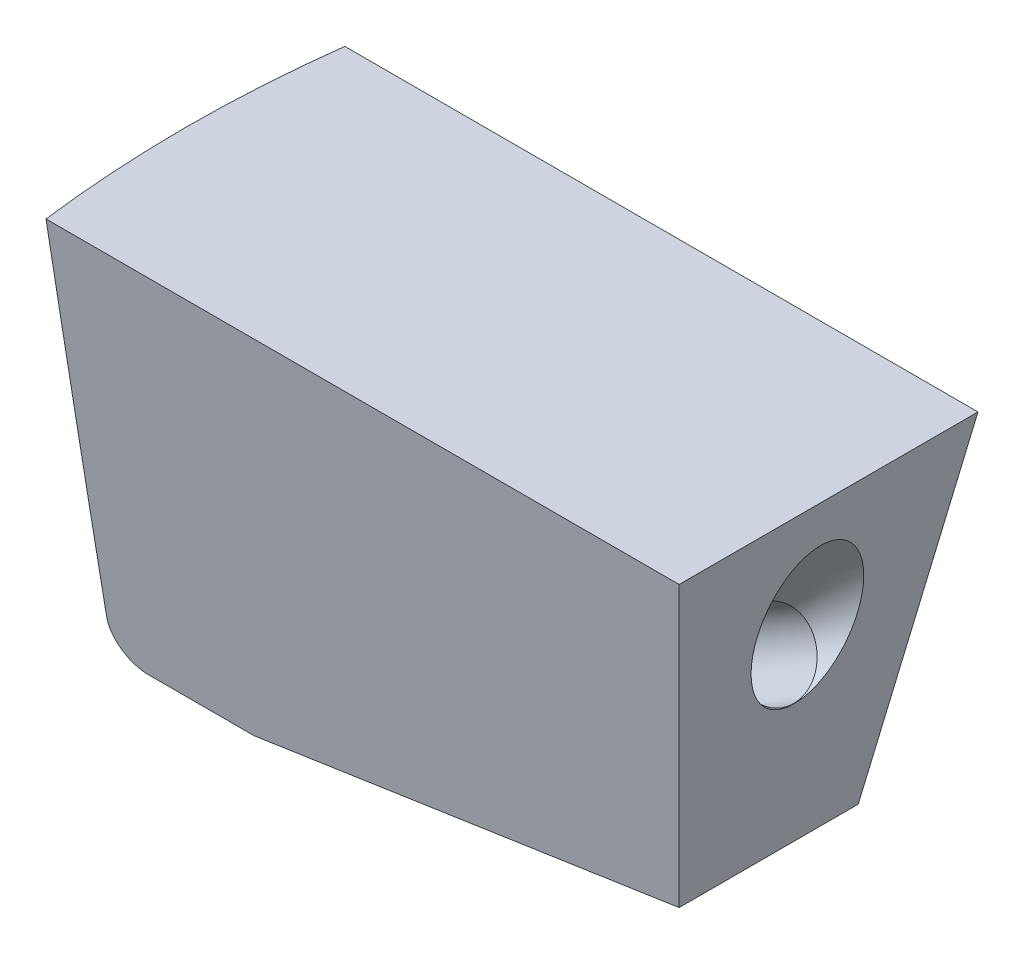
ISO-10303-21;
HEADER;
FILE_DESCRIPTION(('STEP AP214'),'2;1');
FILE_NAME('part.step','',(''),(''),'','','');
FILE_SCHEMA(('AUTOMOTIVE_DESIGN { 1 0 10303 214 1 1 1 1 }'));
ENDSEC;
DATA;
#1=APPLICATION_CONTEXT('core data for automotive mechanical design processes');
#2=APPLICATION_PROTOCOL_DEFINITION('international standard','automotive_design',2000,#1);
#3=PRODUCT_CONTEXT('',#1,'mechanical');
#4=PRODUCT('Part','Part','',(#3));
#5=PRODUCT_RELATED_PRODUCT_CATEGORY('part','',(#4));
#6=PRODUCT_DEFINITION_FORMATION('','',#4);
#7=PRODUCT_DEFINITION_CONTEXT('part definition',#1,'design');
#8=PRODUCT_DEFINITION('design','',#6,#7);
#9=PRODUCT_DEFINITION_SHAPE('','',#8);
#10=(LENGTH_UNIT() NAMED_UNIT(*) SI_UNIT(.MILLI.,.METRE.));
#11=(NAMED_UNIT(*) PLANE_ANGLE_UNIT() SI_UNIT($,.RADIAN.));
#12=(NAMED_UNIT(*) SI_UNIT($,.STERADIAN.) SOLID_ANGLE_UNIT());
#13=UNCERTAINTY_MEASURE_WITH_UNIT(LENGTH_MEASURE(1.E-05),#10,'distance_accuracy_value','');
#14=(GEOMETRIC_REPRESENTATION_CONTEXT(3) GLOBAL_UNCERTAINTY_ASSIGNED_CONTEXT((#13)) GLOBAL_UNIT_ASSIGNED_CONTEXT((#10,
#11,#12)) REPRESENTATION_CONTEXT('',''));
#15=CARTESIAN_POINT('',(0.,0.,0.));
#16=DIRECTION('',(0.,0.,1.));
#17=DIRECTION('',(1.,0.,0.));
#18=AXIS2_PLACEMENT_3D('',#15,#16,#17);
#19=CARTESIAN_POINT('',(0.,29.999999944,0.));
#20=DIRECTION('',(0.,-1.,0.));
#21=DIRECTION('',(0.,0.,-1.));
#22=AXIS2_PLACEMENT_3D('',#19,#20,#21);
#23=CYLINDRICAL_SURFACE('',#22,0.792479999999998);
#24=CARTESIAN_POINT('',(0.,0.279226502732242,0.));
#25=DIRECTION('',(0.,1.,0.));
#26=DIRECTION('',(0.,0.,1.));
#27=AXIS2_PLACEMENT_3D('',#24,#25,#26);
#28=CIRCLE('',#27,0.792479999999998);
#29=CARTESIAN_POINT('',(-0.786140900813095,0.27922650273224,-0.10003516616056));
#30=VERTEX_POINT('',#29);
#31=CARTESIAN_POINT('',(-0.786140900813095,0.27922650273224,0.10003516616056));
#32=VERTEX_POINT('',#31);
#33=EDGE_CURVE('E75',#30,#32,#28,.T.);
#34=ORIENTED_EDGE('',*,*,#33,.F.);
#35=CARTESIAN_POINT('',(0.,-0.288101116436578,0.));
#36=DIRECTION('',(0.,-0.173648177666931,-0.984807753012208));
#37=DIRECTION('',(0.,-0.984807753012208,0.173648177666931));
#38=AXIS2_PLACEMENT_3D('',#35,#36,#37);
#39=ELLIPSE('',#38,4.56371043248163,0.792479999999998);
#40=CARTESIAN_POINT('',(-0.790565318424321,0.02413,-0.0550547700444953));
#41=VERTEX_POINT('',#40);
#42=EDGE_CURVE('E161',#41,#30,#39,.T.);
#43=ORIENTED_EDGE('',*,*,#42,.F.);
#44=CARTESIAN_POINT('',(0.,0.02413,0.));
#45=DIRECTION('',(0.,-1.,0.));
#46=DIRECTION('',(0.,0.,-1.));
#47=AXIS2_PLACEMENT_3D('',#44,#45,#46);
#48=CIRCLE('',#47,0.79248);
#49=CARTESIAN_POINT('',(-0.792479866152421,0.02413,-0.00046058988280647));
#50=VERTEX_POINT('',#49);
#51=EDGE_CURVE('E171',#50,#41,#48,.T.);
#52=ORIENTED_EDGE('',*,*,#51,.F.);
#53=CARTESIAN_POINT('',(-0.790565318424321,0.02413,0.0550547700444953));
#54=VERTEX_POINT('',#53);
#55=EDGE_CURVE('E178',#54,#50,#48,.T.);
#56=ORIENTED_EDGE('',*,*,#55,.F.);
#57=CARTESIAN_POINT('',(0.,-0.288101116436578,0.));
#58=DIRECTION('',(0.,-0.173648177666931,0.984807753012208));
#59=DIRECTION('',(0.,-0.984807753012208,-0.173648177666931));
#60=AXIS2_PLACEMENT_3D('',#57,#58,#59);
#61=ELLIPSE('',#60,4.56371043248163,0.792479999999998);
#62=EDGE_CURVE('E55',#32,#54,#61,.T.);
#63=ORIENTED_EDGE('',*,*,#62,.F.);
#64=EDGE_LOOP('',(#34,#43,#52,#56,#63));
#65=FACE_BOUND('',#64,.T.);
#66=ADVANCED_FACE('F47',(#65),#23,.T.);
#67=CARTESIAN_POINT('',(38.0505893023531,0.,0.0508));
#68=DIRECTION('',(0.,-0.173648177666931,0.984807753012208));
#69=DIRECTION('',(0.,-0.984807753012208,-0.173648177666931));
#70=AXIS2_PLACEMENT_3D('',#67,#68,#69);
#71=PLANE('',#70);
#72=DIRECTION('',(-0.171087869746036,-0.970287525247814,-0.171087869746036));
#73=VECTOR('',#72,1.);
#74=CARTESIAN_POINT('',(0.714345506512774,6.38487372714773,1.17662550651277));
#75=LINE('',#74,#73);
#76=CARTESIAN_POINT('',(-0.362244833839436,0.27922650273224,0.100035166160561));
#77=VERTEX_POINT('',#76);
#78=CARTESIAN_POINT('',(-0.402351353643017,0.0517711261220251,0.0599286463569735));
#79=VERTEX_POINT('',#78);
#80=EDGE_CURVE('E269',#77,#79,#75,.T.);
#81=ORIENTED_EDGE('',*,*,#80,.F.);
#82=DIRECTION('',(-1.,0.,0.));
#83=VECTOR('',#82,1.);
#84=CARTESIAN_POINT('',(38.0505893023531,0.27922650273224,0.10003516616056));
#85=LINE('',#84,#83);
#86=EDGE_CURVE('E68',#77,#32,#85,.T.);
#87=ORIENTED_EDGE('',*,*,#86,.T.);
#88=ORIENTED_EDGE('',*,*,#62,.T.);
#89=CARTESIAN_POINT('',(-0.790562030892619,0.02433,0.055090035440637));
#90=CARTESIAN_POINT('',(-0.790591130197224,0.0229716682347761,0.0548505249016747));
#91=CARTESIAN_POINT('',(-0.790502987341162,0.0216110092912109,0.0546106040183818));
#92=CARTESIAN_POINT('',(-0.790098037345441,0.0189231522553185,0.0541366623026669));
#93=CARTESIAN_POINT('',(-0.789781238751954,0.0175959529143336,0.0539026412500728));
#94=CARTESIAN_POINT('',(-0.78892444074666,0.0150119437472768,0.0534470107155227));
#95=CARTESIAN_POINT('',(-0.788384255019471,0.013755193675145,0.0532254117697985));
#96=CARTESIAN_POINT('',(-0.787094991195339,0.0113508771416751,0.0528014658947843));
#97=CARTESIAN_POINT('',(-0.78634600293641,0.0102032640079511,0.0525991107358934));
#98=CARTESIAN_POINT('',(-0.78466939826834,0.00806424805332879,0.0522219445109276));
#99=CARTESIAN_POINT('',(-0.783744018066812,0.00707114591225422,0.0520468338088568));
#100=CARTESIAN_POINT('',(-0.781734639197898,0.00525473219688734,0.0517265510627087));
#101=CARTESIAN_POINT('',(-0.780650623292242,0.00443143909848094,0.0515813822764286));
#102=CARTESIAN_POINT('',(-0.778372499616051,0.00299079932300508,0.0513273586145304));
#103=CARTESIAN_POINT('',(-0.777180271998541,0.00237056794238561,0.0512179950878451));
#104=CARTESIAN_POINT('',(-0.774706570215517,0.00133774552098709,0.0510358806286719));
#105=CARTESIAN_POINT('',(-0.77342510748044,0.000925127941726121,0.0509631250167336));
#106=CARTESIAN_POINT('',(-0.770819076608367,0.000321291054966233,0.0508566522816508));
#107=CARTESIAN_POINT('',(-0.769494875405856,0.000128533690737079,0.050822663957607));
#108=CARTESIAN_POINT('',(-0.766832408333603,-3.61808735663605E-05,0.0507936203358046));
#109=CARTESIAN_POINT('',(-0.765494142057223,-8.13167220641021E-06,0.0507985661667917));
#110=CARTESIAN_POINT('',(-0.762835759657935,0.000267189932011821,0.0508471127939873));
#111=CARTESIAN_POINT('',(-0.761515736751644,0.000515332728070436,0.0508908670640009));
#112=CARTESIAN_POINT('',(-0.758935670841567,0.00122337607735281,0.0510157142099906));
#113=CARTESIAN_POINT('',(-0.757675631161833,0.00168328835103095,0.051096809152599));
#114=CARTESIAN_POINT('',(-0.755232691044058,0.00280813198321104,0.0512951494340305));
#115=CARTESIAN_POINT('',(-0.7540510824246,0.00347578322134789,0.0514128743610174));
#116=CARTESIAN_POINT('',(-0.751815823874314,0.00499369189982735,0.0516805226152849));
#117=CARTESIAN_POINT('',(-0.750762180687165,0.00584395895734973,0.0518304476383337));
#118=CARTESIAN_POINT('',(-0.748793019018963,0.00771914525337732,0.0521610935761781));
#119=CARTESIAN_POINT('',(-0.747880267982819,0.00874688330644835,0.0523423115240353));
#120=CARTESIAN_POINT('',(-0.746239697073483,0.0109371843161987,0.0527285206879273));
#121=CARTESIAN_POINT('',(-0.745511943653139,0.0120997955027693,0.0529335204081932));
#122=CARTESIAN_POINT('',(-0.744251796134267,0.0145451018720345,0.0533646938971929));
#123=CARTESIAN_POINT('',(-0.743722429063375,0.0158293102622682,0.0535911344852433));
#124=CARTESIAN_POINT('',(-0.742890044599474,0.0184653571145926,0.0540559406677197));
#125=CARTESIAN_POINT('',(-0.74258672897938,0.0198171039512355,0.0542942901061072));
#126=CARTESIAN_POINT('',(-0.74225786477379,0.0222267353646096,0.0547191731378477));
#127=CARTESIAN_POINT('',(-0.742183527393376,0.0232783521171363,0.0549046015446832));
#128=CARTESIAN_POINT('',(-0.742179041809478,0.0243300000000075,0.0550900354406383));
#129=B_SPLINE_CURVE_WITH_KNOTS('',3,(#89,#90,#91,#92,#93,#94,#95,#96,#97,#98,#99,#100,#101,#102,
#103,#104,#105,#106,#107,#108,#109,#110,#111,#112,#113,#114,#115,#116,#117,#118,#119,#120,#121,
#122,#123,#124,#125,#126,#127,#128),.UNSPECIFIED.,.F.,.F.,(4,2,2,2,2,2,2,2,2,2,2,2,2,2,2,2,2,2,
2,4),(0.,0.00413390242035441,0.00826765034116315,0.0124048529782261,0.0165402783094799,
0.0206263980261588,0.0247129620943396,0.0287386615603367,0.0327638463056829,0.0367606963104585,
0.0407576621889021,0.044770505497248,0.0487835709244832,0.052851561939712,0.0569197672419519,
0.0610598067711751,0.0652013313459459,0.0694036978373801,0.0736005103326074,0.0768028366478287),.UNSPECIFIED.);
#130=CARTESIAN_POINT('',(-0.7666693476209,0.,0.0507920655077496));
#131=VERTEX_POINT('',#130);
#132=EDGE_CURVE('E230',#54,#131,#129,.T.);
#133=ORIENTED_EDGE('',*,*,#132,.T.);
#134=CARTESIAN_POINT('',(-0.695960000000009,0.,0.0507841225187557));
#135=DIRECTION('',(-1.,0.,0.));
#136=VECTOR('',#135,1.);
#137=LINE('',#134,#136);
#138=CARTESIAN_POINT('',(-0.695960000000006,0.,0.0507920612593778));
#139=VERTEX_POINT('',#138);
#140=EDGE_CURVE('E262',#139,#131,#137,.T.);
#141=ORIENTED_EDGE('',*,*,#140,.F.);
#142=DIRECTION('',(-0.984346441568213,-0.173566836012845,-0.0306045161452665));
#143=VECTOR('',#142,1.);
#144=CARTESIAN_POINT('',(36.8470407730449,6.61984397304661,1.21805710052844));
#145=LINE('',#144,#143);
#146=EDGE_CURVE('E264',#79,#139,#145,.T.);
#147=ORIENTED_EDGE('',*,*,#146,.F.);
#148=EDGE_LOOP('',(#81,#87,#88,#133,#141,#147));
#149=FACE_BOUND('',#148,.T.);
#150=ADVANCED_FACE('F235',(#149),#71,.T.);
#151=CARTESIAN_POINT('',(38.0505893023531,0.,-0.0508));
#152=DIRECTION('',(0.,-0.173648177666931,-0.984807753012208));
#153=DIRECTION('',(0.,0.984807753012208,-0.173648177666931));
#154=AXIS2_PLACEMENT_3D('',#151,#152,#153);
#155=PLANE('',#154);
#156=ORIENTED_EDGE('',*,*,#42,.T.);
#157=DIRECTION('',(1.,0.,0.));
#158=VECTOR('',#157,1.);
#159=CARTESIAN_POINT('',(38.0505893023531,0.27922650273224,-0.10003516616056));
#160=LINE('',#159,#158);
#161=CARTESIAN_POINT('',(-0.362244833839436,0.27922650273224,-0.100035166160561));
#162=VERTEX_POINT('',#161);
#163=EDGE_CURVE('E164',#30,#162,#160,.T.);
#164=ORIENTED_EDGE('',*,*,#163,.T.);
#165=DIRECTION('',(0.171087869746036,0.970287525247814,-0.171087869746036));
#166=VECTOR('',#165,1.);
#167=CARTESIAN_POINT('',(0.714345506512774,6.38487372714773,-1.17662550651277));
#168=LINE('',#167,#166);
#169=CARTESIAN_POINT('',(-0.402351353643017,0.0517711261220251,-0.0599286463569735));
#170=VERTEX_POINT('',#169);
#171=EDGE_CURVE('E152',#170,#162,#168,.T.);
#172=ORIENTED_EDGE('',*,*,#171,.F.);
#173=DIRECTION('',(0.984346441568213,0.173566836012845,-0.0306045161452665));
#174=VECTOR('',#173,1.);
#175=CARTESIAN_POINT('',(36.8470407730449,6.61984397304661,-1.21805710052844));
#176=LINE('',#175,#174);
#177=CARTESIAN_POINT('',(-0.695960000000006,0.,-0.0507920612593778));
#178=VERTEX_POINT('',#177);
#179=EDGE_CURVE('E160',#178,#170,#176,.T.);
#180=ORIENTED_EDGE('',*,*,#179,.F.);
#181=CARTESIAN_POINT('',(-0.695960000000002,0.,-0.0508000000000001));
#182=DIRECTION('',(-1.,0.,0.));
#183=VECTOR('',#182,1.);
#184=LINE('',#181,#183);
#185=CARTESIAN_POINT('',(-0.766887730553615,0.,-0.0507920612593779));
#186=VERTEX_POINT('',#185);
#187=EDGE_CURVE('E259',#178,#186,#184,.T.);
#188=ORIENTED_EDGE('',*,*,#187,.T.);
#189=CARTESIAN_POINT('',(-0.742179041809478,0.0243300000000076,-0.0550900354406383));
#190=CARTESIAN_POINT('',(-0.742184604135078,0.0229458350404107,-0.0548459698125101));
#191=CARTESIAN_POINT('',(-0.742311508970783,0.0215627401650111,-0.0546020928690976));
#192=CARTESIAN_POINT('',(-0.742798300794755,0.0188378199026354,-0.0541216159065616));
#193=CARTESIAN_POINT('',(-0.74315802579363,0.0174959665005064,-0.0538850109476108));
#194=CARTESIAN_POINT('',(-0.74410093172325,0.0148902350948695,-0.0534255501963176));
#195=CARTESIAN_POINT('',(-0.744684180083338,0.013626380754712,-0.0532026985764623));
#196=CARTESIAN_POINT('',(-0.746057419063688,0.0112129818373202,-0.0527771512321135));
#197=CARTESIAN_POINT('',(-0.74684737839829,0.0100634199982429,-0.0525744524638914));
#198=CARTESIAN_POINT('',(-0.748613528904207,0.00791042373658048,-0.0521948211335958));
#199=CARTESIAN_POINT('',(-0.749589921061213,0.00690714909802567,-0.0520179167457581));
#200=CARTESIAN_POINT('',(-0.751701582892008,0.00507812421606545,-0.0516954103106814));
#201=CARTESIAN_POINT('',(-0.752836866805378,0.00425238990033082,-0.0515498110719205));
#202=CARTESIAN_POINT('',(-0.755221838424719,0.00281191231249112,-0.0512958160080785));
#203=CARTESIAN_POINT('',(-0.756470221114728,0.00219507469079761,-0.0511870508926579));
#204=CARTESIAN_POINT('',(-0.759055675894313,0.00118073995618023,-0.0510081963114751));
#205=CARTESIAN_POINT('',(-0.760392734557678,0.000783209723007457,-0.0509381010057194));
#206=CARTESIAN_POINT('',(-0.763092711791989,0.000226157139190677,-0.0508398776055192));
#207=CARTESIAN_POINT('',(-0.76445477361924,6.26076997739784E-05,-0.0508110394266703));
#208=CARTESIAN_POINT('',(-0.767187277207153,-3.29541307433202E-05,-0.0507941892976242));
#209=CARTESIAN_POINT('',(-0.768557718288063,3.50149389997141E-05,-0.0508061740784735));
#210=CARTESIAN_POINT('',(-0.771244311848206,0.00039866689799616,-0.0508702957304321));
#211=CARTESIAN_POINT('',(-0.772560984858839,0.000690626196253428,-0.0509217760319835));
#212=CARTESIAN_POINT('',(-0.775125082119401,0.00148989015111099,-0.0510627078319327));
#213=CARTESIAN_POINT('',(-0.776372510615765,0.00199718158588093,-0.0511521569989649));
#214=CARTESIAN_POINT('',(-0.778752699896453,0.0032075171166551,-0.0513655718087505));
#215=CARTESIAN_POINT('',(-0.779886288213959,0.00390898415738683,-0.0514892593741092));
#216=CARTESIAN_POINT('',(-0.782018187365782,0.00548879591026707,-0.0517678228105824));
#217=CARTESIAN_POINT('',(-0.783016503586736,0.00636713357582832,-0.0519226974391933));
#218=CARTESIAN_POINT('',(-0.784853641208268,0.00827814175492947,-0.0522596597415234));
#219=CARTESIAN_POINT('',(-0.785691948520383,0.00931129129366988,-0.0524418318803098));
#220=CARTESIAN_POINT('',(-0.78718328744559,0.0115003977901972,-0.0528278304192918));
#221=CARTESIAN_POINT('',(-0.787836257989602,0.0126563950546721,-0.0530316639266439));
#222=CARTESIAN_POINT('',(-0.788947528169182,0.0150739454800639,-0.0534579432938637));
#223=CARTESIAN_POINT('',(-0.789403179275597,0.0163366781618654,-0.0536805971350877));
#224=CARTESIAN_POINT('',(-0.790095791275579,0.0189174377856174,-0.0541356546874782));
#225=CARTESIAN_POINT('',(-0.79033302701083,0.0202353930479441,-0.0543680457595931));
#226=CARTESIAN_POINT('',(-0.790547042656138,0.0224827807287369,-0.0547643208438287));
#227=CARTESIAN_POINT('',(-0.790581450551353,0.0234071736021358,-0.0549273162481835));
#228=CARTESIAN_POINT('',(-0.790562030892619,0.02433,-0.055090035440637));
#229=B_SPLINE_CURVE_WITH_KNOTS('',3,(#189,#190,#191,#192,#193,#194,#195,#196,#197,#198,#199,
#200,#201,#202,#203,#204,#205,#206,#207,#208,#209,#210,#211,#212,#213,#214,#215,#216,#217,#218,
#219,#220,#221,#222,#223,#224,#225,#226,#227,#228),.UNSPECIFIED.,.F.,.F.,(4,2,2,2,2,2,2,2,2,2,2,
2,2,2,2,2,2,2,2,4),(0.,0.00421072501245422,0.00841852347173037,0.0126275922801134,
0.0168360244149653,0.0210490193712216,0.0252623921302361,0.0294321771890222,0.0336013323458577,
0.0376978306041177,0.0417940008374755,0.0458235140020191,0.0498527797820559,0.0538502351412016,
0.057847531271832,0.0618574616558775,0.0658687117954643,0.0699322494680731,0.073990666795414,
0.0768021851502806),.UNSPECIFIED.);
#230=EDGE_CURVE('E229',#186,#41,#229,.T.);
#231=ORIENTED_EDGE('',*,*,#230,.T.);
#232=EDGE_LOOP('',(#156,#164,#172,#180,#188,#231));
#233=FACE_BOUND('',#232,.T.);
#234=ADVANCED_FACE('F165',(#233),#155,.T.);
#235=CARTESIAN_POINT('',(-0.402351353643026,0.0517711261220249,37.6441893023531));
#236=DIRECTION('',(-0.984807753012208,0.173648177666931,0.));
#237=DIRECTION('',(-0.173648177666931,-0.984807753012208,0.));
#238=AXIS2_PLACEMENT_3D('',#235,#236,#237);
#239=PLANE('',#238);
#240=CARTESIAN_POINT('',(-0.376418842530497,0.198841704931548,0.));
#241=DIRECTION('',(-0.984807753012208,0.173648177666931,0.));
#242=DIRECTION('',(0.173648177666931,0.984807753012208,0.));
#243=AXIS2_PLACEMENT_3D('',#240,#241,#242);
#244=ELLIPSE('',#243,0.0510507152050237,0.0366689973897193);
#245=CARTESIAN_POINT('',(-0.367553978866551,0.249116845062273,0.));
#246=VERTEX_POINT('',#245);
#247=EDGE_CURVE('E325',#246,#246,#244,.F.);
#248=ORIENTED_EDGE('',*,*,#247,.F.);
#249=EDGE_LOOP('',(#248));
#250=FACE_BOUND('',#249,.T.);
#251=DIRECTION('',(0.,0.,-1.));
#252=VECTOR('',#251,1.);
#253=CARTESIAN_POINT('',(-0.36224483383944,0.27922650273224,37.6441893023531));
#254=LINE('',#253,#252);
#255=EDGE_CURVE('E13',#77,#162,#254,.T.);
#256=ORIENTED_EDGE('',*,*,#255,.F.);
#257=ORIENTED_EDGE('',*,*,#80,.T.);
#258=DIRECTION('',(0.,0.,-1.));
#259=VECTOR('',#258,1.);
#260=CARTESIAN_POINT('',(-0.402351353643026,0.0517711261220249,37.6441893023531));
#261=LINE('',#260,#259);
#262=EDGE_CURVE('E156',#79,#170,#261,.T.);
#263=ORIENTED_EDGE('',*,*,#262,.T.);
#264=ORIENTED_EDGE('',*,*,#171,.T.);
#265=EDGE_LOOP('',(#256,#257,#263,#264));
#266=FACE_BOUND('',#265,.T.);
#267=ADVANCED_FACE('F154',(#250,#266),#239,.F.);
#268=CARTESIAN_POINT('',(38.4506393023531,-0.33655,0.));
#269=DIRECTION('',(-1.,0.,0.));
#270=DIRECTION('',(0.,0.,1.));
#271=AXIS2_PLACEMENT_3D('',#268,#269,#270);
#272=CYLINDRICAL_SURFACE('',#271,0.34036);
#273=CARTESIAN_POINT('',(-0.772948732447915,0.000743038003496634,-0.0455887319632913));
#274=CARTESIAN_POINT('',(-0.774244052011,0.00103769435949958,-0.0434077682315429));
#275=CARTESIAN_POINT('',(-0.775224602739791,0.00133436726837008,-0.0410456677435132));
#276=CARTESIAN_POINT('',(-0.776890803829397,0.0018872709723606,-0.0362121093467655));
#277=CARTESIAN_POINT('',(-0.7775737422189,0.0021431169148253,-0.0337398631735712));
#278=CARTESIAN_POINT('',(-0.779812108405624,0.00302371478641388,-0.0241755835916275));
#279=CARTESIAN_POINT('',(-0.780678806650201,0.00346735761602371,-0.016903998667424));
#280=CARTESIAN_POINT('',(-0.781500520296575,0.00388075769635123,-0.00233344658422099));
#281=CARTESIAN_POINT('',(-0.781456784046158,0.00385116384133583,0.00496546936265913));
#282=CARTESIAN_POINT('',(-0.780644955446454,0.00345787442285156,0.0159136597539852));
#283=CARTESIAN_POINT('',(-0.780242988222936,0.00326532054040028,0.0195956343719524));
#284=CARTESIAN_POINT('',(-0.77912346117235,0.00276482479812608,0.0269012955115715));
#285=CARTESIAN_POINT('',(-0.778406582971011,0.00245713236796975,0.030525090499023));
#286=CARTESIAN_POINT('',(-0.776968500841151,0.00192066979065399,0.0358575804806954));
#287=CARTESIAN_POINT('',(-0.776428228639165,0.00172921868022671,0.0376189437520824));
#288=CARTESIAN_POINT('',(-0.77517457291461,0.00132570538406224,0.041084531296175));
#289=CARTESIAN_POINT('',(-0.774461031775305,0.00111362453806404,0.0427887019269871));
#290=CARTESIAN_POINT('',(-0.77317001341391,0.000791474460085406,0.0452366898759049));
#291=CARTESIAN_POINT('',(-0.772700748366475,0.000683012576990481,0.0460373882015166));
#292=CARTESIAN_POINT('',(-0.771654205871831,0.000470646071660667,0.0475666843472422));
#293=CARTESIAN_POINT('',(-0.771077514633462,0.000366720325707302,0.0482956421245063));
#294=CARTESIAN_POINT('',(-0.770141774394258,0.000234040944416031,0.0492089072612856));
#295=CARTESIAN_POINT('',(-0.769852715676238,0.000196872823022951,0.0494623993428611));
#296=CARTESIAN_POINT('',(-0.769239237657396,0.000128842579185969,0.0499233352697985));
#297=CARTESIAN_POINT('',(-0.768914947378603,9.79585632287301E-05,0.0501309392132829));
#298=CARTESIAN_POINT('',(-0.768366083833755,5.6874930059774E-05,0.0504058790983309));
#299=CARTESIAN_POINT('',(-0.768153362679428,4.3339299513337E-05,0.0504961293220684));
#300=CARTESIAN_POINT('',(-0.76771625281551,2.12552807332942E-05,0.0506431162934811));
#301=CARTESIAN_POINT('',(-0.767491875887946,1.27019590985884E-05,0.0506998861935238));
#302=CARTESIAN_POINT('',(-0.767033909300799,1.65683510915645E-06,0.0507731565218473));
#303=CARTESIAN_POINT('',(-0.766800250268781,-7.7391373554688E-07,0.0507892513487716));
#304=CARTESIAN_POINT('',(-0.766334261482551,1.20922187474868E-06,0.0507761088778736));
#305=CARTESIAN_POINT('',(-0.76610193111533,5.61964218923094E-06,0.050746894523115));
#306=CARTESIAN_POINT('',(-0.765674443147951,1.99555736495914E-05,0.0506517173017773));
#307=CARTESIAN_POINT('',(-0.765478156067328,2.91608703905509E-05,0.0505905509492956));
#308=CARTESIAN_POINT('',(-0.765097140736894,5.17810441061254E-05,0.05043982984356));
#309=CARTESIAN_POINT('',(-0.764912420443402,6.51987813087307E-05,0.0503502558011914));
#310=CARTESIAN_POINT('',(-0.764453350809652,0.000104045439721472,0.0500900066937025));
#311=CARTESIAN_POINT('',(-0.76418888383395,0.000131934855512073,0.0499023761206639));
#312=CARTESIAN_POINT('',(-0.763691933823009,0.000192879184651407,0.0494894657940845));
#313=CARTESIAN_POINT('',(-0.763459552109705,0.000225949788106223,0.0492640715325612));
#314=CARTESIAN_POINT('',(-0.762822977360723,0.000326550597653554,0.048572891949224));
#315=CARTESIAN_POINT('',(-0.762454817045988,0.000398058835490811,0.0480749630510026));
#316=CARTESIAN_POINT('',(-0.761788113552521,0.000544726314346279,0.0470357211276936));
#317=CARTESIAN_POINT('',(-0.761489789569494,0.000619896179345298,0.0464942784840289));
#318=CARTESIAN_POINT('',(-0.760283242207766,0.000949968171522835,0.0440705383709109));
#319=CARTESIAN_POINT('',(-0.759618423021769,0.00120571102644774,0.0420717997970275));
#320=CARTESIAN_POINT('',(-0.758513193732637,0.00168719156113879,0.0380113817294723));
#321=CARTESIAN_POINT('',(-0.758074367603986,0.00191270946936391,0.0359493625136614));
#322=CARTESIAN_POINT('',(-0.756909140621583,0.00256290814948495,0.0294448965969487));
#323=CARTESIAN_POINT('',(-0.756420088990583,0.00292380951479712,0.0249519471083268));
#324=CARTESIAN_POINT('',(-0.755726813220339,0.00346731140341786,0.0159324800299212));
#325=CARTESIAN_POINT('',(-0.755523399563459,0.00364940412900328,0.0114059034117524));
#326=CARTESIAN_POINT('',(-0.755195420535111,0.00392309590775345,-0.00219818198390475));
#327=CARTESIAN_POINT('',(-0.755353227189989,0.00374200550500385,-0.0112990256858723));
#328=CARTESIAN_POINT('',(-0.756346090185569,0.00298886896378031,-0.0239012198473211));
#329=CARTESIAN_POINT('',(-0.756714509509232,0.00271903025577623,-0.0274644822593403));
#330=CARTESIAN_POINT('',(-0.757752052852071,0.00207287252681375,-0.0345217289153757));
#331=CARTESIAN_POINT('',(-0.758418714183102,0.00169743471555738,-0.0380160406323964));
#332=CARTESIAN_POINT('',(-0.759878165609425,0.00111604546741547,-0.0427604064469519));
#333=CARTESIAN_POINT('',(-0.760356389840992,0.000943223388389248,-0.0441013946499612));
#334=CARTESIAN_POINT('',(-0.761251845619924,0.000682112328119547,-0.0460420527151307));
#335=CARTESIAN_POINT('',(-0.76158262978735,0.000594212378950111,-0.046680863301712));
#336=CARTESIAN_POINT('',(-0.762331429042508,0.000422391343107809,-0.0479051990146692));
#337=CARTESIAN_POINT('',(-0.762748866084356,0.000338448198513183,-0.0484910420657255));
#338=CARTESIAN_POINT('',(-0.763410019126579,0.000233713531660059,-0.0492107696866819));
#339=CARTESIAN_POINT('',(-0.763596253306303,0.00020660459967638,-0.0493958521136108));
#340=CARTESIAN_POINT('',(-0.763989774251133,0.000155443211659795,-0.0497433861174956));
#341=CARTESIAN_POINT('',(-0.764197076520247,0.000131393036299399,-0.0499058208164222));
#342=CARTESIAN_POINT('',(-0.764637008158005,8.75700481129084E-05,-0.0502005843959564));
#343=CARTESIAN_POINT('',(-0.764869933148246,6.78572509512845E-05,-0.0503324920304517));
#344=CARTESIAN_POINT('',(-0.76535662681729,3.51586498593618E-05,-0.0505506967632137));
#345=CARTESIAN_POINT('',(-0.765610338137064,2.21550116331334E-05,-0.0506371147945343));
#346=CARTESIAN_POINT('',(-0.76610880491645,5.34442169015076E-06,-0.0507487221607949));
#347=CARTESIAN_POINT('',(-0.766352493988335,8.50814229844879E-07,-0.050778484161584));
#348=CARTESIAN_POINT('',(-0.766840911424043,-6.29608769503181E-07,-0.0507882949897735));
#349=CARTESIAN_POINT('',(-0.76708564020409,2.3869353510343E-06,-0.0507683215680765));
#350=CARTESIAN_POINT('',(-0.767573471852362,1.53605772823151E-05,-0.0506822396900654));
#351=CARTESIAN_POINT('',(-0.767816329770873,2.55129569149237E-05,-0.0506148330990889));
#352=CARTESIAN_POINT('',(-0.768287725683062,5.1460312149107E-05,-0.0504419878494956));
#353=CARTESIAN_POINT('',(-0.768516237731756,6.72651834435942E-05,-0.0503364824890422));
#354=CARTESIAN_POINT('',(-0.769086367607483,0.000113464945849082,-0.0500267646602611));
#355=CARTESIAN_POINT('',(-0.76941582040774,0.000146982897126944,-0.0498009358985077));
#356=CARTESIAN_POINT('',(-0.770037926081454,0.000220032498537947,-0.0493045512561831));
#357=CARTESIAN_POINT('',(-0.770330476019449,0.000259580318722856,-0.0490338749353075));
#358=CARTESIAN_POINT('',(-0.771066362106513,0.000368969403402115,-0.0482779577392259));
#359=CARTESIAN_POINT('',(-0.771483522594424,0.000441738605875768,-0.0477679608501577));
#360=CARTESIAN_POINT('',(-0.772257093719522,0.000590637805829374,-0.0467056200323934));
#361=CARTESIAN_POINT('',(-0.7726134572155,0.000666770354140639,-0.046153243719995));
#362=CARTESIAN_POINT('',(-0.772948732447915,0.000743038003496634,-0.0455887319632913));
#363=B_SPLINE_CURVE_WITH_KNOTS('',3,(#273,#274,#275,#276,#277,#278,#279,#280,#281,#282,#283,
#284,#285,#286,#287,#288,#289,#290,#291,#292,#293,#294,#295,#296,#297,#298,#299,#300,#301,#302,
#303,#304,#305,#306,#307,#308,#309,#310,#311,#312,#313,#314,#315,#316,#317,#318,#319,#320,#321,
#322,#323,#324,#325,#326,#327,#328,#329,#330,#331,#332,#333,#334,#335,#336,#337,#338,#339,#340,
#341,#342,#343,#344,#345,#346,#347,#348,#349,#350,#351,#352,#353,#354,#355,#356,#357,#358,#359,
#360,#361,#362),.UNSPECIFIED.,.T.,.F.,(4,2,2,2,2,2,2,2,2,2,2,2,2,2,2,2,2,2,2,2,2,2,2,2,2,2,2,2,
2,2,2,2,2,2,2,2,2,2,2,2,2,2,2,2,4),(0.,0.00766052067923835,0.015389457583735,0.0372542358342708,
0.0590890360385518,0.0702051603599439,0.0812973414517136,0.0868503679211078,0.0924084648345304,
0.0952082167140219,0.0979931159960068,0.0991491366123848,0.100301058018431,0.100993276886603,
0.101684809160645,0.102383210483572,0.103081258274729,0.103696082876648,0.104311325847875,
0.105282059353729,0.106255791455912,0.108115409287163,0.109980787913422,0.116297571745215,
0.122658046841626,0.136223636222882,0.149827639985564,0.177038730724686,0.187814077655284,
0.198502045609992,0.202790047800523,0.204961092068028,0.2071180940704,0.207908590804187,
0.208699673535712,0.209501096068015,0.210300377137443,0.211031846425673,0.211763642994825,
0.212516287790466,0.213270256727093,0.214465929056706,0.215664866076207,0.21764615465183,
0.219628972579038),.UNSPECIFIED.);
#364=CARTESIAN_POINT('',(-0.779022295187468,0.0027288660858654,0.0271984758988706));
#365=VERTEX_POINT('',#364);
#366=EDGE_CURVE('E182',#365,#131,#363,.T.);
#367=ORIENTED_EDGE('',*,*,#366,.F.);
#368=CARTESIAN_POINT('',(-0.790851138521022,0.,-0.0507841225187557));
#369=CARTESIAN_POINT('',(-0.781672847989257,0.00265885189672209,-0.033163721467003));
#370=CARTESIAN_POINT('',(-0.772160000000001,0.00380999999999996,-0.0165186674285798));
#371=CARTESIAN_POINT('',(-0.772160000000001,0.00380999999999998,0.0165186674285799));
#372=CARTESIAN_POINT('',(-0.781672847989254,0.00265885189672194,0.0331637214670038));
#373=CARTESIAN_POINT('',(-0.790851138521022,0.,0.0507841225187556));
#374=(BOUNDED_CURVE() B_SPLINE_CURVE(3,(#368,#369,#370,#371,#372,#373),.UNSPECIFIED.,.F.,
.F.) B_SPLINE_CURVE_WITH_KNOTS((4,2,4),(0.,5.07841225187557E-05,0.000101568245037511),
.UNSPECIFIED.) CURVE() GEOMETRIC_REPRESENTATION_ITEM() RATIONAL_B_SPLINE_CURVE((1.,1.,1.,1.,1.,1.)) REPRESENTATION_ITEM(''));
#375=CARTESIAN_POINT('',(-0.779022324608341,0.00272885632661749,-0.0271985976567993));
#376=VERTEX_POINT('',#375);
#377=EDGE_CURVE('E437',#365,#376,#374,.F.);
#378=ORIENTED_EDGE('',*,*,#377,.T.);
#379=EDGE_CURVE('E180',#186,#376,#363,.T.);
#380=ORIENTED_EDGE('',*,*,#379,.F.);
#381=ORIENTED_EDGE('',*,*,#187,.F.);
#382=CARTESIAN_POINT('',(-2.60462989639233,-0.33655,0.));
#383=DIRECTION('',(-0.173648177666931,0.984807753012208,0.));
#384=DIRECTION('',(-0.984807753012208,-0.173648177666931,0.));
#385=AXIS2_PLACEMENT_3D('',#382,#383,#384);
#386=ELLIPSE('',#385,1.96005512164276,0.34036);
#387=CARTESIAN_POINT('',(-0.681167206717202,0.00260836857580135,-0.0285750000000014));
#388=VERTEX_POINT('',#387);
#389=EDGE_CURVE('E445',#388,#178,#386,.T.);
#390=ORIENTED_EDGE('',*,*,#389,.F.);
#391=DIRECTION('',(-1.,0.,0.));
#392=VECTOR('',#391,1.);
#393=CARTESIAN_POINT('',(38.4506393023531,0.00260836857580261,-0.028575));
#394=LINE('',#393,#392);
#395=CARTESIAN_POINT('',(-0.686858489816429,0.00260836857580165,-0.028575));
#396=VERTEX_POINT('',#395);
#397=EDGE_CURVE('E338',#396,#388,#394,.F.);
#398=ORIENTED_EDGE('',*,*,#397,.F.);
#399=CARTESIAN_POINT('',(-0.686858489816427,0.00260836857580261,0.028575));
#400=CARTESIAN_POINT('',(-0.69488255863421,0.00221755981884668,0.0332135322986636));
#401=CARTESIAN_POINT('',(-0.70571650357804,0.00224008059702373,0.0330958620083324));
#402=CARTESIAN_POINT('',(-0.724043586112606,0.00311904698396887,0.0223381582503349));
#403=CARTESIAN_POINT('',(-0.730854835670761,0.00380563943309754,0.011528846176876));
#404=CARTESIAN_POINT('',(-0.730928855863119,0.00381431132404131,-0.0112699230251955));
#405=CARTESIAN_POINT('',(-0.724156392575137,0.00313056384671224,-0.0221747468136089));
#406=CARTESIAN_POINT('',(-0.705841797844351,0.00224694405597969,-0.0330338546009575));
#407=CARTESIAN_POINT('',(-0.694919100214755,0.00221626932534668,-0.0332288492424997));
#408=CARTESIAN_POINT('',(-0.686858489816428,0.00260836857580261,-0.028575));
#409=(BOUNDED_CURVE() B_SPLINE_CURVE(3,(#399,#400,#401,#402,#403,#404,#405,#406,#407,#408),
.UNSPECIFIED.,.F.,.F.) B_SPLINE_CURVE_WITH_KNOTS((4,2,2,2,4),(0.,2.3813958513565E-05,
4.76279170271299E-05,7.14418755406949E-05,9.52558340542599E-05),
.UNSPECIFIED.) CURVE() GEOMETRIC_REPRESENTATION_ITEM() RATIONAL_B_SPLINE_CURVE((1.,1.,1.,1.,1.,
1.,1.,1.,1.,1.)) REPRESENTATION_ITEM(''));
#410=CARTESIAN_POINT('',(-0.686858489816427,0.0026083685758018,0.028575));
#411=VERTEX_POINT('',#410);
#412=EDGE_CURVE('E347',#396,#411,#409,.F.);
#413=ORIENTED_EDGE('',*,*,#412,.T.);
#414=DIRECTION('',(-1.,0.,0.));
#415=VECTOR('',#414,1.);
#416=CARTESIAN_POINT('',(38.4506393023531,0.00260836857580261,0.028575));
#417=LINE('',#416,#415);
#418=CARTESIAN_POINT('',(-0.681167206717202,0.00260836857580135,0.0285750000000014));
#419=VERTEX_POINT('',#418);
#420=EDGE_CURVE('E292',#411,#419,#417,.F.);
#421=ORIENTED_EDGE('',*,*,#420,.T.);
#422=EDGE_CURVE('E629',#139,#419,#386,.T.);
#423=ORIENTED_EDGE('',*,*,#422,.F.);
#424=ORIENTED_EDGE('',*,*,#140,.T.);
#425=EDGE_LOOP('',(#367,#378,#380,#381,#390,#398,#413,#421,#423,#424));
#426=FACE_BOUND('',#425,.T.);
#427=ADVANCED_FACE('F192',(#426),#272,.F.);
#428=CARTESIAN_POINT('',(-0.790851138521022,0.,-0.0507841225187557));
#429=CARTESIAN_POINT('',(-0.791832373230439,0.0125989339100697,-0.0355035476341192));
#430=CARTESIAN_POINT('',(-0.792479999999998,0.0241300000000007,-0.0179646526796647));
#431=CARTESIAN_POINT('',(-0.792479999999998,0.0241300000000007,0.017964652679665));
#432=CARTESIAN_POINT('',(-0.791832373230439,0.0125989339100728,0.0355035476341237));
#433=CARTESIAN_POINT('',(-0.790851138521022,0.,0.0507841225187556));
#434=CARTESIAN_POINT('',(-0.790851138521022,0.,-0.0507841225187557));
#435=CARTESIAN_POINT('',(-0.79193261126447,0.00254129614606872,-0.0339425595178969));
#436=CARTESIAN_POINT('',(-0.792479999999999,0.00381000000000268,-0.016979031380042));
#437=CARTESIAN_POINT('',(-0.792479999999999,0.00381000000000268,0.0169790313800422));
#438=CARTESIAN_POINT('',(-0.791932611264468,0.00254129614606973,0.0339425595178987));
#439=CARTESIAN_POINT('',(-0.790851138521022,0.,0.0507841225187556));
#440=CARTESIAN_POINT('',(-0.790851138521022,0.,-0.0507841225187557));
#441=CARTESIAN_POINT('',(-0.781672847989257,0.00265885189672209,-0.033163721467003));
#442=CARTESIAN_POINT('',(-0.772160000000001,0.00380999999999996,-0.0165186674285798));
#443=CARTESIAN_POINT('',(-0.772160000000001,0.00380999999999998,0.0165186674285799));
#444=CARTESIAN_POINT('',(-0.781672847989254,0.00265885189672194,0.0331637214670038));
#445=CARTESIAN_POINT('',(-0.790851138521022,0.,0.0507841225187556));
#446=(BOUNDED_SURFACE() B_SPLINE_SURFACE(2,3,((#428,#429,#430,#431,#432,#433),(#434,#435,#436,
#437,#438,#439),(#440,#441,#442,#443,#444,#445)),.UNSPECIFIED.,.F.,.F.,
.F.) B_SPLINE_SURFACE_WITH_KNOTS((3,3),(4,2,4),(0.,1.),(0.,5.07841225187557E-05,
0.000101568245037511),
.UNSPECIFIED.) GEOMETRIC_REPRESENTATION_ITEM() RATIONAL_B_SPLINE_SURFACE(((1.,1.,1.,1.,1.,1.),
(0.703718137053402,0.705925465674504,0.707106781186581,0.707106781186584,0.705925465674544,
0.703718137053402),(1.,1.,1.,1.,1.,1.))) REPRESENTATION_ITEM('') SURFACE());
#447=CARTESIAN_POINT('',(-0.779023602444763,0.00272998884510631,0.0272149524723561));
#448=CARTESIAN_POINT('',(-0.779199442141799,0.0028058329073321,0.0262669990025348));
#449=CARTESIAN_POINT('',(-0.779445857388201,0.00291845942652972,0.0253355199967695));
#450=CARTESIAN_POINT('',(-0.78005694116399,0.00322789832591783,0.0235360627644025));
#451=CARTESIAN_POINT('',(-0.78042057702876,0.00342398016266576,0.0226676083076788));
#452=CARTESIAN_POINT('',(-0.781659123230632,0.0041552132252891,0.0201797144288282));
#453=CARTESIAN_POINT('',(-0.782682177339546,0.00483347558971794,0.0186754343023401));
#454=CARTESIAN_POINT('',(-0.785500189248717,0.00715506685279744,0.0150460338455988));
#455=CARTESIAN_POINT('',(-0.787346441289878,0.00914104907547052,0.013195562991453));
#456=CARTESIAN_POINT('',(-0.790254556536467,0.0137727817690296,0.0097754775505434));
#457=CARTESIAN_POINT('',(-0.791320241983767,0.0164152312442971,0.00820452329119624));
#458=CARTESIAN_POINT('',(-0.792088729397661,0.0198257750388788,0.00580369951002361));
#459=CARTESIAN_POINT('',(-0.792225940416515,0.0206554431821974,0.00518907844985812));
#460=CARTESIAN_POINT('',(-0.792380774293502,0.0219930381932427,0.00403163000997894));
#461=CARTESIAN_POINT('',(-0.792421901945274,0.0225229238478168,0.0035224004248));
#462=CARTESIAN_POINT('',(-0.792472399805577,0.0234383885201799,0.00237034137449361));
#463=CARTESIAN_POINT('',(-0.792480889418711,0.0238197197567943,0.00172429731814165));
#464=CARTESIAN_POINT('',(-0.792479265637913,0.0240568522061575,0.000986849417517824));
#465=B_SPLINE_CURVE_WITH_KNOTS('',3,(#447,#448,#449,#450,#451,#452,#453,#454,#455,#456,#457,
#458,#459,#460,#461,#462,#463,#464),.UNSPECIFIED.,.F.,.F.,(4,2,2,2,2,2,2,2,4),(0.,
0.00289743671862763,0.00577001552976657,0.011508428237137,0.0211539572698017,0.0307519328638736,
0.0338732606244796,0.0360600842495119,0.0383055119397278),.UNSPECIFIED.);
#466=EDGE_CURVE('E61',#365,#50,#465,.T.);
#467=CARTESIAN_POINT('',(-0.779023602460259,0.00272998884712135,-0.0272149525138253));
#468=CARTESIAN_POINT('',(-0.779199402077442,0.00280576407542572,-0.026266974217391));
#469=CARTESIAN_POINT('',(-0.779445822930496,0.00291841840985918,-0.0253355575771497));
#470=CARTESIAN_POINT('',(-0.780056931560268,0.00322791674215996,-0.0235361547553069));
#471=CARTESIAN_POINT('',(-0.780420595277151,0.00342403629455502,-0.0226676963260677));
#472=CARTESIAN_POINT('',(-0.781659056862827,0.00415508361175899,-0.0201795985327603));
#473=CARTESIAN_POINT('',(-0.782681846243115,0.00483282819531627,-0.018674856183587));
#474=CARTESIAN_POINT('',(-0.785407702767041,0.00707946952145638,-0.015166749402276));
#475=CARTESIAN_POINT('',(-0.787154839741659,0.00893843719412379,-0.0133960511422511));
#476=CARTESIAN_POINT('',(-0.790075603473629,0.0133936693730816,-0.0100116041533538));
#477=CARTESIAN_POINT('',(-0.791205362910826,0.0160295105497946,-0.00841515605112433));
#478=CARTESIAN_POINT('',(-0.792114611275952,0.0198945012530943,-0.00577925868823745));
#479=CARTESIAN_POINT('',(-0.792293728025559,0.0211155369851608,-0.00490383761322666));
#480=CARTESIAN_POINT('',(-0.79245513842563,0.0228641297684923,-0.00313119292600568));
#481=CARTESIAN_POINT('',(-0.792482044800701,0.0234885969265618,-0.00233038333653216));
#482=CARTESIAN_POINT('',(-0.792478239499586,0.02397203981971,-0.00140386716398259));
#483=B_SPLINE_CURVE_WITH_KNOTS('',3,(#467,#468,#469,#470,#471,#472,#473,#474,#475,#476,#477,
#478,#479,#480,#481,#482),.UNSPECIFIED.,.F.,.F.,(4,2,2,2,2,2,2,4),(0.,0.00289733310111036,
0.00577001551682547,0.0115084282091496,0.0206461826719088,0.0303688267050513,0.0348472182459106,
0.0378941095628324),.UNSPECIFIED.);
#484=EDGE_CURVE('E440',#50,#376,#483,.F.);
#485=ORIENTED_EDGE('',*,*,#377,.F.);
#486=ORIENTED_EDGE('',*,*,#466,.T.);
#487=ORIENTED_EDGE('',*,*,#484,.T.);
#488=EDGE_LOOP('',(#485,#486,#487));
#489=FACE_BOUND('',#488,.T.);
#490=ADVANCED_FACE('F50',(#489),#446,.T.);
#491=CARTESIAN_POINT('',(-0.69596,0.,37.6441893023531));
#492=DIRECTION('',(-0.173648177666931,0.984807753012208,0.));
#493=DIRECTION('',(-0.984807753012208,-0.173648177666931,0.));
#494=AXIS2_PLACEMENT_3D('',#491,#492,#493);
#495=PLANE('',#494);
#496=ORIENTED_EDGE('',*,*,#146,.T.);
#497=ORIENTED_EDGE('',*,*,#422,.T.);
#498=DIRECTION('',(-0.984807753012208,-0.173648177666931,0.));
#499=VECTOR('',#498,1.);
#500=CARTESIAN_POINT('',(-0.69596,0.,0.0285750000000029));
#501=LINE('',#500,#499);
#502=CARTESIAN_POINT('',(-0.53086,0.0291115845149677,0.0285750000000014));
#503=VERTEX_POINT('',#502);
#504=EDGE_CURVE('E336',#503,#419,#501,.T.);
#505=ORIENTED_EDGE('',*,*,#504,.F.);
#506=DIRECTION('',(0.,0.,1.));
#507=VECTOR('',#506,1.);
#508=CARTESIAN_POINT('',(-0.53086,0.0291115845149677,37.6441893023531));
#509=LINE('',#508,#507);
#510=CARTESIAN_POINT('',(-0.53086,0.0291115845149677,-0.0285750000000014));
#511=VERTEX_POINT('',#510);
#512=EDGE_CURVE('E335',#511,#503,#509,.T.);
#513=ORIENTED_EDGE('',*,*,#512,.F.);
#514=DIRECTION('',(-0.984807753012208,-0.173648177666931,0.));
#515=VECTOR('',#514,1.);
#516=CARTESIAN_POINT('',(-0.69596,0.,-0.0285750000000029));
#517=LINE('',#516,#515);
#518=EDGE_CURVE('E252',#511,#388,#517,.T.);
#519=ORIENTED_EDGE('',*,*,#518,.T.);
#520=ORIENTED_EDGE('',*,*,#389,.T.);
#521=ORIENTED_EDGE('',*,*,#179,.T.);
#522=ORIENTED_EDGE('',*,*,#262,.F.);
#523=EDGE_LOOP('',(#496,#497,#505,#513,#519,#520,#521,#522));
#524=FACE_BOUND('',#523,.T.);
#525=ADVANCED_FACE('F309',(#524),#495,.F.);
#526=CARTESIAN_POINT('',(-0.634105053817371,0.09398,0.));
#527=DIRECTION('',(-0.500000000000004,-0.866025403784436,0.));
#528=DIRECTION('',(0.866025403784436,-0.500000000000004,0.));
#529=AXIS2_PLACEMENT_3D('',#526,#527,#528);
#530=CYLINDRICAL_SURFACE('',#529,0.028575);
#531=DIRECTION('',(-0.500000000000004,-0.866025403784436,0.));
#532=VECTOR('',#531,1.);
#533=CARTESIAN_POINT('',(-0.516273324086857,0.298070542636973,0.028575));
#534=LINE('',#533,#532);
#535=CARTESIAN_POINT('',(-0.634105053817371,0.09398,0.028575));
#536=VERTEX_POINT('',#535);
#537=EDGE_CURVE('E356',#536,#411,#534,.T.);
#538=ORIENTED_EDGE('',*,*,#537,.T.);
#539=CARTESIAN_POINT('',(-0.686858489816428,0.00260836857580261,-0.028575));
#540=CARTESIAN_POINT('',(-0.694917954934892,0.0072775026050886,-0.0285749999999996));
#541=CARTESIAN_POINT('',(-0.701413297601776,0.00979968639561031,-0.0246185446540692));
#542=CARTESIAN_POINT('',(-0.710742221783251,0.0131243082575387,-0.0139838160543498));
#543=CARTESIAN_POINT('',(-0.713318673133645,0.0139673876968951,-0.00698118055188068));
#544=CARTESIAN_POINT('',(-0.713269884530429,0.0139726401064732,0.00714153323062057));
#545=CARTESIAN_POINT('',(-0.710664706380069,0.0131325634305103,0.0140922105999723));
#546=CARTESIAN_POINT('',(-0.701314069961336,0.0098077208381423,0.0246677652429077));
#547=CARTESIAN_POINT('',(-0.69488496521766,0.00726516076958966,0.0285749999999999));
#548=CARTESIAN_POINT('',(-0.686858489816427,0.00260836857580261,0.028575));
#549=(BOUNDED_CURVE() B_SPLINE_CURVE(3,(#539,#540,#541,#542,#543,#544,#545,#546,#547,#548),
.UNSPECIFIED.,.F.,.F.) B_SPLINE_CURVE_WITH_KNOTS((4,2,2,2,4),(0.,2.3813958513565E-05,
4.76279170271299E-05,7.14418755406949E-05,9.52558340542599E-05),
.UNSPECIFIED.) CURVE() GEOMETRIC_REPRESENTATION_ITEM() RATIONAL_B_SPLINE_CURVE((1.,1.,1.,1.,1.,
1.,1.,1.,1.,1.)) REPRESENTATION_ITEM(''));
#550=EDGE_CURVE('E286',#411,#396,#549,.F.);
#551=ORIENTED_EDGE('',*,*,#550,.T.);
#552=DIRECTION('',(0.500000000000004,0.866025403784436,0.));
#553=VECTOR('',#552,1.);
#554=CARTESIAN_POINT('',(-0.634105053817371,0.09398,-0.028575));
#555=LINE('',#554,#553);
#556=CARTESIAN_POINT('',(-0.634105053817371,0.09398,-0.028575));
#557=VERTEX_POINT('',#556);
#558=EDGE_CURVE('E354',#396,#557,#555,.T.);
#559=ORIENTED_EDGE('',*,*,#558,.T.);
#560=CARTESIAN_POINT('',(-0.634105053817371,0.09398,0.));
#561=DIRECTION('',(0.,-1.,0.));
#562=DIRECTION('',(-1.,0.,0.));
#563=AXIS2_PLACEMENT_3D('',#560,#561,#562);
#564=ELLIPSE('',#563,0.0329955678841872,0.028575);
#565=EDGE_CURVE('E328',#557,#536,#564,.F.);
#566=ORIENTED_EDGE('',*,*,#565,.T.);
#567=EDGE_LOOP('',(#538,#551,#559,#566));
#568=FACE_BOUND('',#567,.T.);
#569=ADVANCED_FACE('F295',(#568),#530,.F.);
#570=CARTESIAN_POINT('',(-0.53086,0.09398,0.028575));
#571=DIRECTION('',(-1.,0.,0.));
#572=DIRECTION('',(0.,0.,1.));
#573=AXIS2_PLACEMENT_3D('',#570,#571,#572);
#574=PLANE('',#573);
#575=ORIENTED_EDGE('',*,*,#512,.T.);
#576=DIRECTION('',(0.,1.,0.));
#577=VECTOR('',#576,1.);
#578=CARTESIAN_POINT('',(-0.53086,0.09398,0.028575));
#579=LINE('',#578,#577);
#580=CARTESIAN_POINT('',(-0.53086,0.09398,0.028575));
#581=VERTEX_POINT('',#580);
#582=EDGE_CURVE('E619',#503,#581,#579,.T.);
#583=ORIENTED_EDGE('',*,*,#582,.T.);
#584=DIRECTION('',(0.,0.,-1.));
#585=VECTOR('',#584,1.);
#586=CARTESIAN_POINT('',(-0.53086,0.09398,0.028575));
#587=LINE('',#586,#585);
#588=CARTESIAN_POINT('',(-0.53086,0.09398,0.0254000000000018));
#589=VERTEX_POINT('',#588);
#590=EDGE_CURVE('E648',#581,#589,#587,.T.);
#591=ORIENTED_EDGE('',*,*,#590,.T.);
#592=CARTESIAN_POINT('',(-0.53086,0.0939800000000001,0.));
#593=DIRECTION('',(1.,0.,0.));
#594=DIRECTION('',(0.,1.,0.));
#595=AXIS2_PLACEMENT_3D('',#592,#593,#594);
#596=ELLIPSE('',#595,0.0293293936748329,0.0254);
#597=CARTESIAN_POINT('',(-0.53086,0.09398,-0.0254));
#598=VERTEX_POINT('',#597);
#599=EDGE_CURVE('E641',#598,#589,#596,.F.);
#600=ORIENTED_EDGE('',*,*,#599,.F.);
#601=CARTESIAN_POINT('',(-0.53086,0.09398,-0.028575));
#602=VERTEX_POINT('',#601);
#603=EDGE_CURVE('E645',#598,#602,#587,.T.);
#604=ORIENTED_EDGE('',*,*,#603,.T.);
#605=DIRECTION('',(0.,1.,0.));
#606=VECTOR('',#605,1.);
#607=CARTESIAN_POINT('',(-0.53086,0.09398,-0.028575));
#608=LINE('',#607,#606);
#609=EDGE_CURVE('E622',#511,#602,#608,.T.);
#610=ORIENTED_EDGE('',*,*,#609,.F.);
#611=EDGE_LOOP('',(#575,#583,#591,#600,#604,#610));
#612=FACE_BOUND('',#611,.T.);
#613=ADVANCED_FACE('F308',(#612),#574,.T.);
#614=CARTESIAN_POINT('',(0.,0.,0.028575));
#615=DIRECTION('',(0.,0.,-1.));
#616=DIRECTION('',(-1.,0.,0.));
#617=AXIS2_PLACEMENT_3D('',#614,#615,#616);
#618=PLANE('',#617);
#619=ORIENTED_EDGE('',*,*,#420,.F.);
#620=ORIENTED_EDGE('',*,*,#537,.F.);
#621=DIRECTION('',(-1.,0.,0.));
#622=VECTOR('',#621,1.);
#623=CARTESIAN_POINT('',(-0.667100621701558,0.09398,0.028575));
#624=LINE('',#623,#622);
#625=EDGE_CURVE('E625',#581,#536,#624,.T.);
#626=ORIENTED_EDGE('',*,*,#625,.F.);
#627=ORIENTED_EDGE('',*,*,#582,.F.);
#628=ORIENTED_EDGE('',*,*,#504,.T.);
#629=EDGE_LOOP('',(#619,#620,#626,#627,#628));
#630=FACE_BOUND('',#629,.T.);
#631=ADVANCED_FACE('F570',(#630),#618,.T.);
#632=CARTESIAN_POINT('',(0.,0.,-0.028575));
#633=DIRECTION('',(0.,0.,-1.));
#634=DIRECTION('',(-1.,0.,0.));
#635=AXIS2_PLACEMENT_3D('',#632,#633,#634);
#636=PLANE('',#635);
#637=ORIENTED_EDGE('',*,*,#558,.F.);
#638=ORIENTED_EDGE('',*,*,#397,.T.);
#639=ORIENTED_EDGE('',*,*,#518,.F.);
#640=ORIENTED_EDGE('',*,*,#609,.T.);
#641=DIRECTION('',(-1.,0.,0.));
#642=VECTOR('',#641,1.);
#643=CARTESIAN_POINT('',(-0.667100621701558,0.09398,-0.028575));
#644=LINE('',#643,#642);
#645=EDGE_CURVE('E627',#602,#557,#644,.T.);
#646=ORIENTED_EDGE('',*,*,#645,.T.);
#647=EDGE_LOOP('',(#637,#638,#639,#640,#646));
#648=FACE_BOUND('',#647,.T.);
#649=ADVANCED_FACE('F561',(#648),#636,.F.);
#650=CARTESIAN_POINT('',(-0.398281113875288,0.170524455592962,0.));
#651=DIRECTION('',(0.866025403784442,0.499999999999995,0.));
#652=DIRECTION('',(-0.499999999999995,0.866025403784442,0.));
#653=AXIS2_PLACEMENT_3D('',#650,#651,#652);
#654=CONICAL_SURFACE('',#653,0.0254,0.392699081698725);
#655=CARTESIAN_POINT('',(-0.398281113875288,0.170524455592962,0.));
#656=DIRECTION('',(0.866025403784442,0.499999999999995,0.));
#657=DIRECTION('',(-0.499999999999995,0.866025403784442,0.));
#658=AXIS2_PLACEMENT_3D('',#655,#656,#657);
#659=CIRCLE('',#658,0.0254);
#660=CARTESIAN_POINT('',(-0.410981113875288,0.192521500849087,0.));
#661=VERTEX_POINT('',#660);
#662=EDGE_CURVE('E630',#661,#661,#659,.T.);
#663=ORIENTED_EDGE('',*,*,#662,.F.);
#664=EDGE_LOOP('',(#663));
#665=FACE_BOUND('',#664,.T.);
#666=ORIENTED_EDGE('',*,*,#247,.T.);
#667=EDGE_LOOP('',(#666));
#668=FACE_BOUND('',#667,.T.);
#669=ADVANCED_FACE('F551',(#665,#668),#654,.F.);
#670=CARTESIAN_POINT('',(-0.667100621701558,0.09398,0.028575));
#671=DIRECTION('',(0.,-1.,0.));
#672=DIRECTION('',(1.,0.,0.));
#673=AXIS2_PLACEMENT_3D('',#670,#671,#672);
#674=PLANE('',#673);
#675=ORIENTED_EDGE('',*,*,#645,.F.);
#676=ORIENTED_EDGE('',*,*,#603,.F.);
#677=CARTESIAN_POINT('',(-0.53086,0.09398,0.));
#678=DIRECTION('',(0.,1.,0.));
#679=DIRECTION('',(1.,0.,0.));
#680=AXIS2_PLACEMENT_3D('',#677,#678,#679);
#681=ELLIPSE('',#680,0.0508000000000005,0.0254);
#682=EDGE_CURVE('E633',#589,#598,#681,.F.);
#683=ORIENTED_EDGE('',*,*,#682,.F.);
#684=ORIENTED_EDGE('',*,*,#590,.F.);
#685=ORIENTED_EDGE('',*,*,#625,.T.);
#686=ORIENTED_EDGE('',*,*,#565,.F.);
#687=EDGE_LOOP('',(#675,#676,#683,#684,#685,#686));
#688=FACE_BOUND('',#687,.T.);
#689=ADVANCED_FACE('F539',(#688),#674,.T.);
#690=CARTESIAN_POINT('',(-0.786963694095365,-0.0538815367264147,0.));
#691=DIRECTION('',(0.866025403784441,0.499999999999995,0.));
#692=DIRECTION('',(-0.499999999999995,0.866025403784441,0.));
#693=AXIS2_PLACEMENT_3D('',#690,#691,#692);
#694=CYLINDRICAL_SURFACE('',#693,0.0254);
#695=ORIENTED_EDGE('',*,*,#599,.T.);
#696=ORIENTED_EDGE('',*,*,#682,.T.);
#697=EDGE_LOOP('',(#695,#696));
#698=FACE_BOUND('',#697,.T.);
#699=ORIENTED_EDGE('',*,*,#662,.T.);
#700=EDGE_LOOP('',(#699));
#701=FACE_BOUND('',#700,.T.);
#702=ADVANCED_FACE('F385',(#698,#701),#694,.F.);
#703=CARTESIAN_POINT('',(-0.686858489816427,0.00260836857580261,0.028575));
#704=CARTESIAN_POINT('',(-0.69488496521766,0.00726516076958966,0.0285749999999999));
#705=CARTESIAN_POINT('',(-0.701314069961336,0.0098077208381423,0.0246677652429077));
#706=CARTESIAN_POINT('',(-0.710664706380069,0.0131325634305103,0.0140922105999723));
#707=CARTESIAN_POINT('',(-0.713269884530429,0.0139726401064732,0.00714153323062057));
#708=CARTESIAN_POINT('',(-0.713318673133645,0.0139673876968951,-0.00698118055188068));
#709=CARTESIAN_POINT('',(-0.710742221783251,0.0131243082575387,-0.0139838160543498));
#710=CARTESIAN_POINT('',(-0.701413297601776,0.00979968639561031,-0.0246185446540692));
#711=CARTESIAN_POINT('',(-0.694917954934892,0.0072775026050886,-0.0285749999999996));
#712=CARTESIAN_POINT('',(-0.686858489816428,0.00260836857580261,-0.028575));
#713=CARTESIAN_POINT('',(-0.686858489816428,0.00260836857580261,0.028575));
#714=CARTESIAN_POINT('',(-0.694116962758151,0.00260876055560092,0.0285741662095625));
#715=CARTESIAN_POINT('',(-0.702221929050101,0.00287957069672924,0.0265346542955274));
#716=CARTESIAN_POINT('',(-0.714764887738007,0.00350059584721619,0.0164549899921411));
#717=CARTESIAN_POINT('',(-0.719130052831381,0.00380799896314757,0.00837485384697571));
#718=CARTESIAN_POINT('',(-0.719190198104896,0.00381197852692305,-0.00818587207913691));
#719=CARTESIAN_POINT('',(-0.714858778864622,0.00350612718148514,-0.0163355095917537));
#720=CARTESIAN_POINT('',(-0.7023317761787,0.00288331781779009,-0.0264894153475464));
#721=CARTESIAN_POINT('',(-0.694148305336989,0.00260871264191532,-0.0285747525397279));
#722=CARTESIAN_POINT('',(-0.686858489816428,0.00260836857580261,-0.028575));
#723=CARTESIAN_POINT('',(-0.686858489816427,0.00260836857580261,0.028575));
#724=CARTESIAN_POINT('',(-0.69488255863421,0.00221755981884668,0.0332135322986636));
#725=CARTESIAN_POINT('',(-0.70571650357804,0.00224008059702373,0.0330958620083324));
#726=CARTESIAN_POINT('',(-0.724043586112606,0.00311904698396887,0.0223381582503349));
#727=CARTESIAN_POINT('',(-0.730854835670761,0.00380563943309754,0.011528846176876));
#728=CARTESIAN_POINT('',(-0.730928855863119,0.00381431132404131,-0.0112699230251955));
#729=CARTESIAN_POINT('',(-0.724156392575137,0.00313056384671224,-0.0221747468136089));
#730=CARTESIAN_POINT('',(-0.705841797844351,0.00224694405597969,-0.0330338546009575));
#731=CARTESIAN_POINT('',(-0.694919100214755,0.00221626932534668,-0.0332288492424997));
#732=CARTESIAN_POINT('',(-0.686858489816428,0.00260836857580261,-0.028575));
#733=(BOUNDED_SURFACE() B_SPLINE_SURFACE(2,3,((#703,#704,#705,#706,#707,#708,#709,#710,#711,
#712),(#713,#714,#715,#716,#717,#718,#719,#720,#721,#722),(#723,#724,#725,#726,#727,#728,#729,
#730,#731,#732)),.UNSPECIFIED.,.F.,.F.,.F.) B_SPLINE_SURFACE_WITH_KNOTS((3,3),(4,2,2,2,4),(0.,
1.),(0.,2.3813958513565E-05,4.76279170271299E-05,7.14418755406949E-05,9.52558340542599E-05),
.UNSPECIFIED.) GEOMETRIC_REPRESENTATION_ITEM() RATIONAL_B_SPLINE_SURFACE(((1.,1.,1.,1.,1.,1.,1.,
1.,1.,1.),(0.736191287601463,0.795437788404296,0.825303848195349,0.860781274302667,
0.865976760447195,0.866073506091955,0.860951495617436,0.825623070257534,0.795671165272131,
0.736191287601469),(1.,1.,1.,1.,1.,1.,1.,1.,1.,1.))) REPRESENTATION_ITEM('') SURFACE());
#734=ORIENTED_EDGE('',*,*,#550,.F.);
#735=ORIENTED_EDGE('',*,*,#412,.F.);
#736=EDGE_LOOP('',(#734,#735));
#737=FACE_BOUND('',#736,.T.);
#738=ADVANCED_FACE('F374',(#737),#733,.T.);
#739=CARTESIAN_POINT('',(0.,0.02413,0.));
#740=DIRECTION('',(0.,-1.,0.));
#741=DIRECTION('',(0.,0.,-1.));
#742=AXIS2_PLACEMENT_3D('',#739,#740,#741);
#743=TOROIDAL_SURFACE('',#742,0.76835,0.02413);
#744=ORIENTED_EDGE('',*,*,#379,.T.);
#745=ORIENTED_EDGE('',*,*,#484,.F.);
#746=ORIENTED_EDGE('',*,*,#51,.T.);
#747=ORIENTED_EDGE('',*,*,#230,.F.);
#748=EDGE_LOOP('',(#744,#745,#746,#747));
#749=FACE_BOUND('',#748,.T.);
#750=ADVANCED_FACE('F199',(#749),#743,.T.);
#751=ORIENTED_EDGE('',*,*,#55,.T.);
#752=ORIENTED_EDGE('',*,*,#466,.F.);
#753=ORIENTED_EDGE('',*,*,#366,.T.);
#754=ORIENTED_EDGE('',*,*,#132,.F.);
#755=EDGE_LOOP('',(#751,#752,#753,#754));
#756=FACE_BOUND('',#755,.T.);
#757=ADVANCED_FACE('F195',(#756),#743,.T.);
#758=CARTESIAN_POINT('',(0.,0.27922650273224,0.));
#759=DIRECTION('',(0.,1.,0.));
#760=DIRECTION('',(0.,0.,1.));
#761=AXIS2_PLACEMENT_3D('',#758,#759,#760);
#762=PLANE('',#761);
#763=ORIENTED_EDGE('',*,*,#163,.F.);
#764=ORIENTED_EDGE('',*,*,#33,.T.);
#765=ORIENTED_EDGE('',*,*,#86,.F.);
#766=ORIENTED_EDGE('',*,*,#255,.T.);
#767=EDGE_LOOP('',(#763,#764,#765,#766));
#768=FACE_BOUND('',#767,.T.);
#769=ADVANCED_FACE('F169',(#768),#762,.T.);
#770=CLOSED_SHELL('',(#66,#150,#234,#267,#427,#490,#525,#569,#613,#631,#649,#669,#689,#702,#738,
#750,#757,#769));
#771=MANIFOLD_SOLID_BREP('B2',#770);
#772=ADVANCED_BREP_SHAPE_REPRESENTATION('',(#18,#771),#14);
#773=SHAPE_DEFINITION_REPRESENTATION(#9,#772);
ENDSEC;
END-ISO-10303-21;
